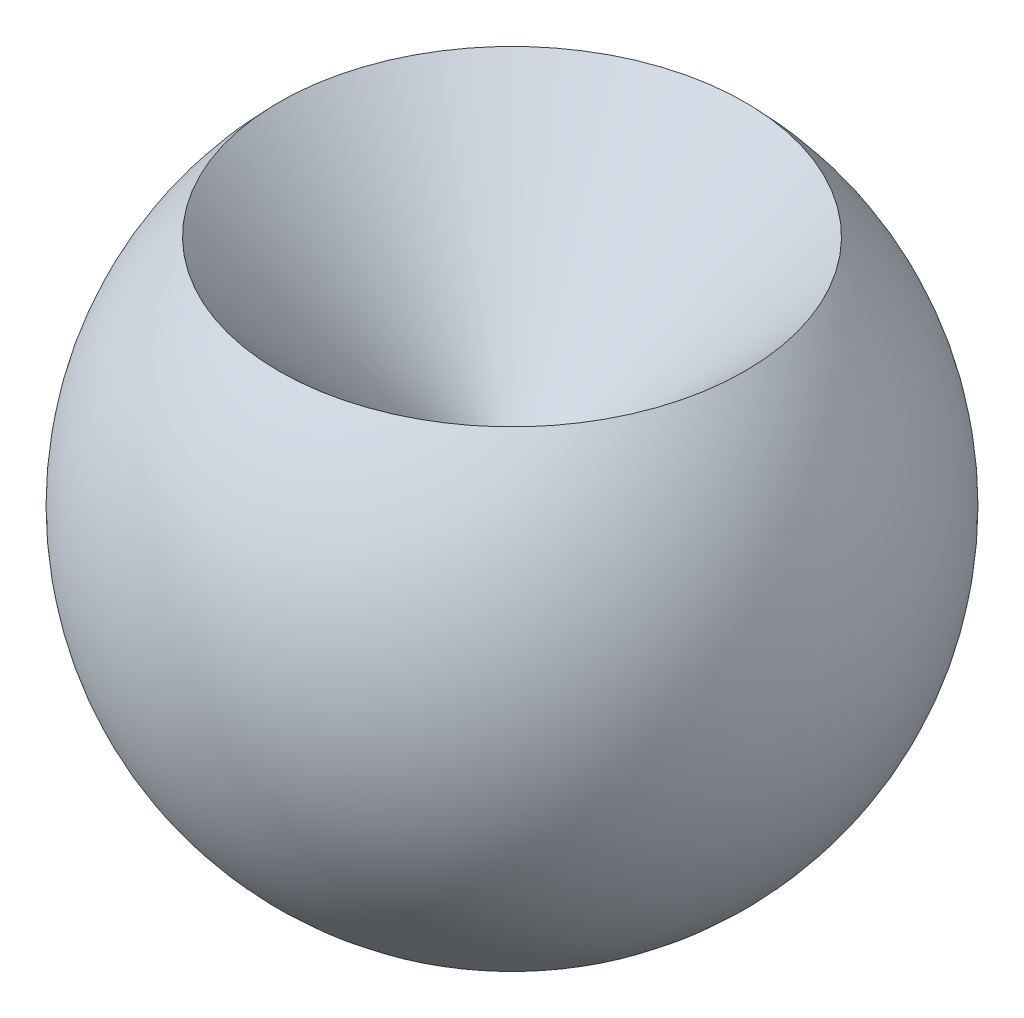
ISO-10303-21;
HEADER;
FILE_DESCRIPTION(('STEP AP214'),'2;1');
FILE_NAME('part.step','',(''),(''),'','','');
FILE_SCHEMA(('AUTOMOTIVE_DESIGN { 1 0 10303 214 1 1 1 1 }'));
ENDSEC;
DATA;
#1=APPLICATION_CONTEXT('core data for automotive mechanical design processes');
#2=APPLICATION_PROTOCOL_DEFINITION('international standard','automotive_design',2000,#1);
#3=PRODUCT_CONTEXT('',#1,'mechanical');
#4=PRODUCT('Part','Part','',(#3));
#5=PRODUCT_RELATED_PRODUCT_CATEGORY('part','',(#4));
#6=PRODUCT_DEFINITION_FORMATION('','',#4);
#7=PRODUCT_DEFINITION_CONTEXT('part definition',#1,'design');
#8=PRODUCT_DEFINITION('design','',#6,#7);
#9=PRODUCT_DEFINITION_SHAPE('','',#8);
#10=(LENGTH_UNIT() NAMED_UNIT(*) SI_UNIT(.MILLI.,.METRE.));
#11=(NAMED_UNIT(*) PLANE_ANGLE_UNIT() SI_UNIT($,.RADIAN.));
#12=(NAMED_UNIT(*) SI_UNIT($,.STERADIAN.) SOLID_ANGLE_UNIT());
#13=UNCERTAINTY_MEASURE_WITH_UNIT(LENGTH_MEASURE(1.E-05),#10,'distance_accuracy_value','');
#14=(GEOMETRIC_REPRESENTATION_CONTEXT(3) GLOBAL_UNCERTAINTY_ASSIGNED_CONTEXT((#13)) GLOBAL_UNIT_ASSIGNED_CONTEXT((#10,
#11,#12)) REPRESENTATION_CONTEXT('',''));
#15=CARTESIAN_POINT('',(0.,0.,0.));
#16=DIRECTION('',(0.,0.,1.));
#17=DIRECTION('',(1.,0.,0.));
#18=AXIS2_PLACEMENT_3D('',#15,#16,#17);
#19=CARTESIAN_POINT('',(0.,3.53553390593276,0.));
#20=DIRECTION('',(0.,1.,0.));
#21=DIRECTION('',(0.,0.,1.));
#22=AXIS2_PLACEMENT_3D('',#19,#20,#21);
#23=CONICAL_SURFACE('',#22,3.53553390593272,0.785398163397443);
#24=CARTESIAN_POINT('',(0.,0.,0.));
#25=VERTEX_POINT('',#24);
#26=VERTEX_LOOP('',#25);
#27=FACE_BOUND('',#26,.T.);
#28=CARTESIAN_POINT('',(0.,3.53553390593276,0.));
#29=DIRECTION('',(0.,1.,0.));
#30=DIRECTION('',(0.,0.,1.));
#31=AXIS2_PLACEMENT_3D('',#28,#29,#30);
#32=CIRCLE('',#31,3.53553390593272);
#33=CARTESIAN_POINT('',(0.,3.53553390593276,3.53553390593272));
#34=VERTEX_POINT('',#33);
#35=EDGE_CURVE('E11',#34,#34,#32,.T.);
#36=ORIENTED_EDGE('',*,*,#35,.T.);
#37=EDGE_LOOP('',(#36));
#38=FACE_BOUND('',#37,.T.);
#39=ADVANCED_FACE('F33',(#27,#38),#23,.F.);
#40=CARTESIAN_POINT('',(0.,0.,0.));
#41=DIRECTION('',(0.,1.,0.));
#42=DIRECTION('',(1.,0.,0.));
#43=AXIS2_PLACEMENT_3D('',#40,#41,#42);
#44=SPHERICAL_SURFACE('',#43,5.);
#45=ORIENTED_EDGE('',*,*,#35,.F.);
#46=EDGE_LOOP('',(#45));
#47=FACE_BOUND('',#46,.T.);
#48=ADVANCED_FACE('F42',(#47),#44,.T.);
#49=CLOSED_SHELL('',(#39,#48));
#50=MANIFOLD_SOLID_BREP('B2',#49);
#51=ADVANCED_BREP_SHAPE_REPRESENTATION('',(#18,#50),#14);
#52=SHAPE_DEFINITION_REPRESENTATION(#9,#51);
ENDSEC;
END-ISO-10303-21;
